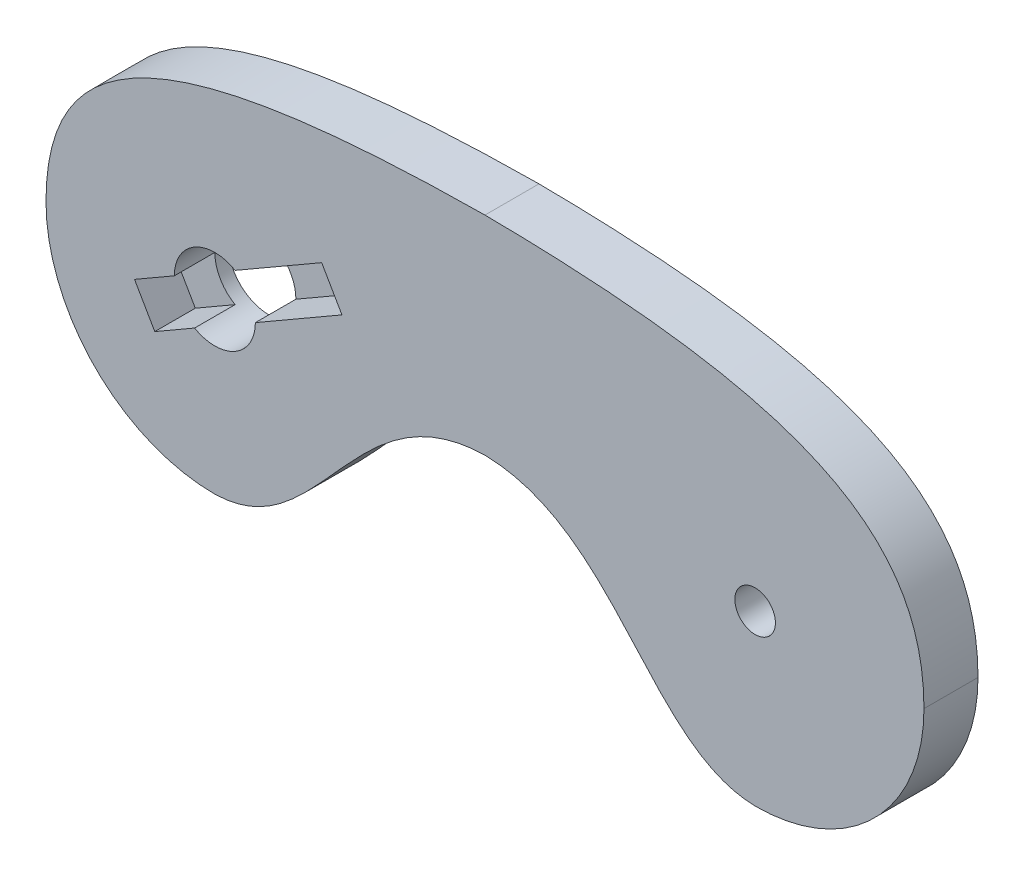
ISO-10303-21;
HEADER;
FILE_DESCRIPTION(('STEP AP214'),'2;1');
FILE_NAME('part.step','',(''),(''),'','','');
FILE_SCHEMA(('AUTOMOTIVE_DESIGN { 1 0 10303 214 1 1 1 1 }'));
ENDSEC;
DATA;
#1=APPLICATION_CONTEXT('core data for automotive mechanical design processes');
#2=APPLICATION_PROTOCOL_DEFINITION('international standard','automotive_design',2000,#1);
#3=PRODUCT_CONTEXT('',#1,'mechanical');
#4=PRODUCT('Part','Part','',(#3));
#5=PRODUCT_RELATED_PRODUCT_CATEGORY('part','',(#4));
#6=PRODUCT_DEFINITION_FORMATION('','',#4);
#7=PRODUCT_DEFINITION_CONTEXT('part definition',#1,'design');
#8=PRODUCT_DEFINITION('design','',#6,#7);
#9=PRODUCT_DEFINITION_SHAPE('','',#8);
#10=(LENGTH_UNIT() NAMED_UNIT(*) SI_UNIT(.MILLI.,.METRE.));
#11=(NAMED_UNIT(*) PLANE_ANGLE_UNIT() SI_UNIT($,.RADIAN.));
#12=(NAMED_UNIT(*) SI_UNIT($,.STERADIAN.) SOLID_ANGLE_UNIT());
#13=UNCERTAINTY_MEASURE_WITH_UNIT(LENGTH_MEASURE(1.E-05),#10,'distance_accuracy_value','');
#14=(GEOMETRIC_REPRESENTATION_CONTEXT(3) GLOBAL_UNCERTAINTY_ASSIGNED_CONTEXT((#13)) GLOBAL_UNIT_ASSIGNED_CONTEXT((#10,
#11,#12)) REPRESENTATION_CONTEXT('',''));
#15=CARTESIAN_POINT('',(0.,0.,0.));
#16=DIRECTION('',(0.,0.,1.));
#17=DIRECTION('',(1.,0.,0.));
#18=AXIS2_PLACEMENT_3D('',#15,#16,#17);
#19=CARTESIAN_POINT('',(104.786762405388,11.7820972603127,4.));
#20=DIRECTION('',(0.,0.,-1.));
#21=DIRECTION('',(-1.,0.,0.));
#22=AXIS2_PLACEMENT_3D('',#19,#20,#21);
#23=PLANE('',#22);
#24=CARTESIAN_POINT('',(112.5,0.,4.));
#25=CARTESIAN_POINT('',(112.5,11.1158308056532,4.));
#26=CARTESIAN_POINT('',(102.764699747701,15.1709178933789,4.));
#27=CARTESIAN_POINT('',(80.,15.3965319854051,4.));
#28=B_SPLINE_CURVE_WITH_KNOTS('',3,(#24,#25,#26,#27),.UNSPECIFIED.,.F.,.F.,(4,4),(0.,1.),.UNSPECIFIED.);
#29=CARTESIAN_POINT('',(112.5,0.,4.));
#30=VERTEX_POINT('',#29);
#31=CARTESIAN_POINT('',(80.,15.3965319854051,4.));
#32=VERTEX_POINT('',#31);
#33=EDGE_CURVE('E191',#30,#32,#28,.T.);
#34=ORIENTED_EDGE('',*,*,#33,.T.);
#35=CARTESIAN_POINT('',(80.,15.3965319854051,4.));
#36=CARTESIAN_POINT('',(57.2353002522993,15.1709178933789,4.));
#37=CARTESIAN_POINT('',(47.5,11.1158308056532,4.));
#38=CARTESIAN_POINT('',(47.5,0.,4.));
#39=B_SPLINE_CURVE_WITH_KNOTS('',3,(#35,#36,#37,#38),.UNSPECIFIED.,.F.,.F.,(4,4),(0.,1.),.UNSPECIFIED.);
#40=CARTESIAN_POINT('',(47.5,0.,4.));
#41=VERTEX_POINT('',#40);
#42=EDGE_CURVE('E197',#32,#41,#39,.T.);
#43=ORIENTED_EDGE('',*,*,#42,.T.);
#44=CARTESIAN_POINT('',(60.,0.,4.));
#45=DIRECTION('',(0.,0.,1.));
#46=DIRECTION('',(-1.,0.,0.));
#47=AXIS2_PLACEMENT_3D('',#44,#45,#46);
#48=CIRCLE('',#47,12.5);
#49=CARTESIAN_POINT('',(60.,-12.5,4.));
#50=VERTEX_POINT('',#49);
#51=EDGE_CURVE('E206',#41,#50,#48,.T.);
#52=ORIENTED_EDGE('',*,*,#51,.T.);
#53=CARTESIAN_POINT('',(60.,-12.5,4.));
#54=CARTESIAN_POINT('',(67.8597913120576,-12.3290143676797,4.));
#55=CARTESIAN_POINT('',(70.1748273884092,-0.222632889192769,4.));
#56=CARTESIAN_POINT('',(80.,0.,4.));
#57=B_SPLINE_CURVE_WITH_KNOTS('',3,(#53,#54,#55,#56),.UNSPECIFIED.,.F.,.F.,(4,4),(0.,1.),.UNSPECIFIED.);
#58=CARTESIAN_POINT('',(80.,0.,4.));
#59=VERTEX_POINT('',#58);
#60=EDGE_CURVE('E226',#50,#59,#57,.T.);
#61=ORIENTED_EDGE('',*,*,#60,.T.);
#62=CARTESIAN_POINT('',(80.,0.,4.));
#63=CARTESIAN_POINT('',(89.8251726115908,-0.222632889192771,4.));
#64=CARTESIAN_POINT('',(92.1402086879425,-12.3290143676797,4.));
#65=CARTESIAN_POINT('',(100.,-12.5,4.));
#66=B_SPLINE_CURVE_WITH_KNOTS('',3,(#62,#63,#64,#65),.UNSPECIFIED.,.F.,.F.,(4,4),(0.,1.),.UNSPECIFIED.);
#67=CARTESIAN_POINT('',(100.,-12.5,4.));
#68=VERTEX_POINT('',#67);
#69=EDGE_CURVE('E230',#59,#68,#66,.T.);
#70=ORIENTED_EDGE('',*,*,#69,.T.);
#71=CARTESIAN_POINT('',(100.,0.,4.));
#72=DIRECTION('',(0.,0.,1.));
#73=DIRECTION('',(-1.,0.,0.));
#74=AXIS2_PLACEMENT_3D('',#71,#72,#73);
#75=CIRCLE('',#74,12.5);
#76=EDGE_CURVE('E238',#68,#30,#75,.T.);
#77=ORIENTED_EDGE('',*,*,#76,.T.);
#78=EDGE_LOOP('',(#34,#43,#52,#61,#70,#77));
#79=FACE_BOUND('',#78,.T.);
#80=CARTESIAN_POINT('',(100.,0.,4.));
#81=DIRECTION('',(0.,0.,1.));
#82=DIRECTION('',(1.,0.,0.));
#83=AXIS2_PLACEMENT_3D('',#80,#81,#82);
#84=CIRCLE('',#83,1.5);
#85=CARTESIAN_POINT('',(101.5,0.,4.));
#86=VERTEX_POINT('',#85);
#87=EDGE_CURVE('E185',#86,#86,#84,.T.);
#88=ORIENTED_EDGE('',*,*,#87,.F.);
#89=EDGE_LOOP('',(#88));
#90=FACE_BOUND('',#89,.T.);
#91=CARTESIAN_POINT('',(60.,0.,4.));
#92=DIRECTION('',(0.,0.,1.));
#93=DIRECTION('',(1.,0.,0.));
#94=AXIS2_PLACEMENT_3D('',#91,#92,#93);
#95=CIRCLE('',#94,3.00000000000001);
#96=CARTESIAN_POINT('',(61.5,2.59807621135331,4.));
#97=VERTEX_POINT('',#96);
#98=CARTESIAN_POINT('',(57.,0.,4.));
#99=VERTEX_POINT('',#98);
#100=EDGE_CURVE('E182',#97,#99,#95,.T.);
#101=ORIENTED_EDGE('',*,*,#100,.F.);
#102=DIRECTION('',(-0.866025403784438,-0.500000000000002,0.));
#103=VECTOR('',#102,1.);
#104=CARTESIAN_POINT('',(54.0538475772934,-1.70096189432335,4.));
#105=LINE('',#104,#103);
#106=CARTESIAN_POINT('',(67.9102540378444,6.29903810567667,4.));
#107=VERTEX_POINT('',#106);
#108=EDGE_CURVE('E159',#107,#97,#105,.T.);
#109=ORIENTED_EDGE('',*,*,#108,.F.);
#110=DIRECTION('',(-0.500000000000004,0.866025403784436,0.));
#111=VECTOR('',#110,1.);
#112=CARTESIAN_POINT('',(69.4102540378444,3.70096189432336,4.));
#113=LINE('',#112,#111);
#114=CARTESIAN_POINT('',(69.4102540378444,3.70096189432336,4.));
#115=VERTEX_POINT('',#114);
#116=EDGE_CURVE('E166',#115,#107,#113,.T.);
#117=ORIENTED_EDGE('',*,*,#116,.F.);
#118=DIRECTION('',(0.866025403784438,0.500000000000001,0.));
#119=VECTOR('',#118,1.);
#120=CARTESIAN_POINT('',(55.5538475772934,-4.29903810567667,4.));
#121=LINE('',#120,#119);
#122=CARTESIAN_POINT('',(63.,0.,4.));
#123=VERTEX_POINT('',#122);
#124=EDGE_CURVE('E167',#123,#115,#121,.T.);
#125=ORIENTED_EDGE('',*,*,#124,.F.);
#126=CARTESIAN_POINT('',(58.5,-2.59807621135334,4.));
#127=VERTEX_POINT('',#126);
#128=EDGE_CURVE('E179',#127,#123,#95,.T.);
#129=ORIENTED_EDGE('',*,*,#128,.F.);
#130=CARTESIAN_POINT('',(55.5538475772934,-4.29903810567667,4.));
#131=VERTEX_POINT('',#130);
#132=EDGE_CURVE('E164',#131,#127,#121,.T.);
#133=ORIENTED_EDGE('',*,*,#132,.F.);
#134=DIRECTION('',(0.499999999999995,-0.866025403784442,0.));
#135=VECTOR('',#134,1.);
#136=CARTESIAN_POINT('',(54.8038475772934,-3.00000000000001,4.));
#137=LINE('',#136,#135);
#138=CARTESIAN_POINT('',(54.0538475772934,-1.70096189432335,4.));
#139=VERTEX_POINT('',#138);
#140=EDGE_CURVE('E143',#139,#131,#137,.T.);
#141=ORIENTED_EDGE('',*,*,#140,.F.);
#142=EDGE_CURVE('E170',#99,#139,#105,.T.);
#143=ORIENTED_EDGE('',*,*,#142,.F.);
#144=EDGE_LOOP('',(#101,#109,#117,#125,#129,#133,#141,#143));
#145=FACE_BOUND('',#144,.T.);
#146=ADVANCED_FACE('F34',(#79,#90,#145),#23,.F.);
#147=CARTESIAN_POINT('',(104.786762405388,11.7820972603127,0.));
#148=DIRECTION('',(0.,0.,-1.));
#149=DIRECTION('',(-1.,0.,0.));
#150=AXIS2_PLACEMENT_3D('',#147,#148,#149);
#151=PLANE('',#150);
#152=CARTESIAN_POINT('',(100.,0.,0.));
#153=DIRECTION('',(0.,0.,1.));
#154=DIRECTION('',(1.,0.,0.));
#155=AXIS2_PLACEMENT_3D('',#152,#153,#154);
#156=CIRCLE('',#155,1.5);
#157=CARTESIAN_POINT('',(101.5,0.,0.));
#158=VERTEX_POINT('',#157);
#159=EDGE_CURVE('E189',#158,#158,#156,.T.);
#160=ORIENTED_EDGE('',*,*,#159,.T.);
#161=EDGE_LOOP('',(#160));
#162=FACE_BOUND('',#161,.T.);
#163=CARTESIAN_POINT('',(112.5,0.,0.));
#164=CARTESIAN_POINT('',(112.5,11.1158308056532,0.));
#165=CARTESIAN_POINT('',(102.764699747701,15.1709178933789,0.));
#166=CARTESIAN_POINT('',(80.,15.3965319854051,0.));
#167=B_SPLINE_CURVE_WITH_KNOTS('',3,(#163,#164,#165,#166),.UNSPECIFIED.,.F.,.F.,(4,4),(0.,1.),.UNSPECIFIED.);
#168=CARTESIAN_POINT('',(112.5,0.,0.));
#169=VERTEX_POINT('',#168);
#170=CARTESIAN_POINT('',(80.,15.3965319854051,0.));
#171=VERTEX_POINT('',#170);
#172=EDGE_CURVE('E188',#169,#171,#167,.T.);
#173=ORIENTED_EDGE('',*,*,#172,.F.);
#174=CARTESIAN_POINT('',(100.,0.,0.));
#175=DIRECTION('',(0.,0.,1.));
#176=DIRECTION('',(-1.,0.,0.));
#177=AXIS2_PLACEMENT_3D('',#174,#175,#176);
#178=CIRCLE('',#177,12.5);
#179=CARTESIAN_POINT('',(100.,-12.5,0.));
#180=VERTEX_POINT('',#179);
#181=EDGE_CURVE('E198',#180,#169,#178,.T.);
#182=ORIENTED_EDGE('',*,*,#181,.F.);
#183=CARTESIAN_POINT('',(80.,0.,0.));
#184=CARTESIAN_POINT('',(89.8251726115908,-0.222632889192771,0.));
#185=CARTESIAN_POINT('',(92.1402086879425,-12.3290143676797,0.));
#186=CARTESIAN_POINT('',(100.,-12.5,0.));
#187=B_SPLINE_CURVE_WITH_KNOTS('',3,(#183,#184,#185,#186),.UNSPECIFIED.,.F.,.F.,(4,4),(0.,1.),.UNSPECIFIED.);
#188=CARTESIAN_POINT('',(80.,0.,0.));
#189=VERTEX_POINT('',#188);
#190=EDGE_CURVE('E264',#189,#180,#187,.T.);
#191=ORIENTED_EDGE('',*,*,#190,.F.);
#192=CARTESIAN_POINT('',(60.,-12.5,0.));
#193=CARTESIAN_POINT('',(67.8597913120576,-12.3290143676797,0.));
#194=CARTESIAN_POINT('',(70.1748273884092,-0.222632889192769,0.));
#195=CARTESIAN_POINT('',(80.,0.,0.));
#196=B_SPLINE_CURVE_WITH_KNOTS('',3,(#192,#193,#194,#195),.UNSPECIFIED.,.F.,.F.,(4,4),(0.,1.),.UNSPECIFIED.);
#197=CARTESIAN_POINT('',(60.,-12.5,0.));
#198=VERTEX_POINT('',#197);
#199=EDGE_CURVE('E260',#198,#189,#196,.T.);
#200=ORIENTED_EDGE('',*,*,#199,.F.);
#201=CARTESIAN_POINT('',(60.,0.,0.));
#202=DIRECTION('',(0.,0.,1.));
#203=DIRECTION('',(-1.,0.,0.));
#204=AXIS2_PLACEMENT_3D('',#201,#202,#203);
#205=CIRCLE('',#204,12.5);
#206=CARTESIAN_POINT('',(47.5,0.,0.));
#207=VERTEX_POINT('',#206);
#208=EDGE_CURVE('E255',#207,#198,#205,.T.);
#209=ORIENTED_EDGE('',*,*,#208,.F.);
#210=CARTESIAN_POINT('',(80.,15.3965319854051,0.));
#211=CARTESIAN_POINT('',(57.2353002522993,15.1709178933789,0.));
#212=CARTESIAN_POINT('',(47.5,11.1158308056532,0.));
#213=CARTESIAN_POINT('',(47.5,0.,0.));
#214=B_SPLINE_CURVE_WITH_KNOTS('',3,(#210,#211,#212,#213),.UNSPECIFIED.,.F.,.F.,(4,4),(0.,1.),.UNSPECIFIED.);
#215=EDGE_CURVE('E248',#171,#207,#214,.T.);
#216=ORIENTED_EDGE('',*,*,#215,.F.);
#217=EDGE_LOOP('',(#173,#182,#191,#200,#209,#216));
#218=FACE_BOUND('',#217,.T.);
#219=CARTESIAN_POINT('',(60.,0.,0.));
#220=DIRECTION('',(0.,0.,1.));
#221=DIRECTION('',(1.,0.,0.));
#222=AXIS2_PLACEMENT_3D('',#219,#220,#221);
#223=CIRCLE('',#222,3.00000000000001);
#224=CARTESIAN_POINT('',(63.,0.,0.));
#225=VERTEX_POINT('',#224);
#226=EDGE_CURVE('E174',#225,#225,#223,.T.);
#227=ORIENTED_EDGE('',*,*,#226,.T.);
#228=EDGE_LOOP('',(#227));
#229=FACE_BOUND('',#228,.T.);
#230=ADVANCED_FACE('F335',(#162,#218,#229),#151,.T.);
#231=DIRECTION('',(0.,0.,-1.));
#232=VECTOR('',#231,1.);
#233=SURFACE_OF_LINEAR_EXTRUSION('',#28,#232);
#234=ORIENTED_EDGE('',*,*,#172,.T.);
#235=DIRECTION('',(0.,0.,-1.));
#236=VECTOR('',#235,1.);
#237=CARTESIAN_POINT('',(80.,15.3965319854051,4.));
#238=LINE('',#237,#236);
#239=EDGE_CURVE('E289',#32,#171,#238,.T.);
#240=ORIENTED_EDGE('',*,*,#239,.F.);
#241=ORIENTED_EDGE('',*,*,#33,.F.);
#242=DIRECTION('',(0.,0.,-1.));
#243=VECTOR('',#242,1.);
#244=CARTESIAN_POINT('',(112.5,0.,4.));
#245=LINE('',#244,#243);
#246=EDGE_CURVE('E243',#30,#169,#245,.T.);
#247=ORIENTED_EDGE('',*,*,#246,.T.);
#248=EDGE_LOOP('',(#234,#240,#241,#247));
#249=FACE_BOUND('',#248,.T.);
#250=ADVANCED_FACE('F36',(#249),#233,.F.);
#251=DIRECTION('',(0.,0.,-1.));
#252=VECTOR('',#251,1.);
#253=SURFACE_OF_LINEAR_EXTRUSION('',#39,#252);
#254=ORIENTED_EDGE('',*,*,#215,.T.);
#255=DIRECTION('',(0.,0.,-1.));
#256=VECTOR('',#255,1.);
#257=CARTESIAN_POINT('',(47.5,0.,4.));
#258=LINE('',#257,#256);
#259=EDGE_CURVE('E286',#41,#207,#258,.T.);
#260=ORIENTED_EDGE('',*,*,#259,.F.);
#261=ORIENTED_EDGE('',*,*,#42,.F.);
#262=ORIENTED_EDGE('',*,*,#239,.T.);
#263=EDGE_LOOP('',(#254,#260,#261,#262));
#264=FACE_BOUND('',#263,.T.);
#265=ADVANCED_FACE('F211',(#264),#253,.F.);
#266=CARTESIAN_POINT('',(60.,0.,4.));
#267=DIRECTION('',(0.,0.,-1.));
#268=DIRECTION('',(-1.,0.,0.));
#269=AXIS2_PLACEMENT_3D('',#266,#267,#268);
#270=CYLINDRICAL_SURFACE('',#269,12.5);
#271=ORIENTED_EDGE('',*,*,#208,.T.);
#272=DIRECTION('',(0.,0.,-1.));
#273=VECTOR('',#272,1.);
#274=CARTESIAN_POINT('',(60.,-12.5,4.));
#275=LINE('',#274,#273);
#276=EDGE_CURVE('E283',#50,#198,#275,.T.);
#277=ORIENTED_EDGE('',*,*,#276,.F.);
#278=ORIENTED_EDGE('',*,*,#51,.F.);
#279=ORIENTED_EDGE('',*,*,#259,.T.);
#280=EDGE_LOOP('',(#271,#277,#278,#279));
#281=FACE_BOUND('',#280,.T.);
#282=ADVANCED_FACE('F214',(#281),#270,.T.);
#283=DIRECTION('',(0.,0.,-1.));
#284=VECTOR('',#283,1.);
#285=SURFACE_OF_LINEAR_EXTRUSION('',#57,#284);
#286=ORIENTED_EDGE('',*,*,#199,.T.);
#287=DIRECTION('',(0.,0.,-1.));
#288=VECTOR('',#287,1.);
#289=CARTESIAN_POINT('',(80.,0.,4.));
#290=LINE('',#289,#288);
#291=EDGE_CURVE('E280',#59,#189,#290,.T.);
#292=ORIENTED_EDGE('',*,*,#291,.F.);
#293=ORIENTED_EDGE('',*,*,#60,.F.);
#294=ORIENTED_EDGE('',*,*,#276,.T.);
#295=EDGE_LOOP('',(#286,#292,#293,#294));
#296=FACE_BOUND('',#295,.T.);
#297=ADVANCED_FACE('F218',(#296),#285,.F.);
#298=DIRECTION('',(0.,0.,-1.));
#299=VECTOR('',#298,1.);
#300=SURFACE_OF_LINEAR_EXTRUSION('',#66,#299);
#301=ORIENTED_EDGE('',*,*,#190,.T.);
#302=DIRECTION('',(0.,0.,-1.));
#303=VECTOR('',#302,1.);
#304=CARTESIAN_POINT('',(100.,-12.5,4.));
#305=LINE('',#304,#303);
#306=EDGE_CURVE('E277',#68,#180,#305,.T.);
#307=ORIENTED_EDGE('',*,*,#306,.F.);
#308=ORIENTED_EDGE('',*,*,#69,.F.);
#309=ORIENTED_EDGE('',*,*,#291,.T.);
#310=EDGE_LOOP('',(#301,#307,#308,#309));
#311=FACE_BOUND('',#310,.T.);
#312=ADVANCED_FACE('F222',(#311),#300,.F.);
#313=CARTESIAN_POINT('',(100.,0.,4.));
#314=DIRECTION('',(0.,0.,-1.));
#315=DIRECTION('',(-1.,0.,0.));
#316=AXIS2_PLACEMENT_3D('',#313,#314,#315);
#317=CYLINDRICAL_SURFACE('',#316,12.5);
#318=ORIENTED_EDGE('',*,*,#181,.T.);
#319=ORIENTED_EDGE('',*,*,#246,.F.);
#320=ORIENTED_EDGE('',*,*,#76,.F.);
#321=ORIENTED_EDGE('',*,*,#306,.T.);
#322=EDGE_LOOP('',(#318,#319,#320,#321));
#323=FACE_BOUND('',#322,.T.);
#324=ADVANCED_FACE('F347',(#323),#317,.T.);
#325=CARTESIAN_POINT('',(100.,0.,4.));
#326=DIRECTION('',(0.,0.,-1.));
#327=DIRECTION('',(-1.,0.,0.));
#328=AXIS2_PLACEMENT_3D('',#325,#326,#327);
#329=CYLINDRICAL_SURFACE('',#328,1.5);
#330=ORIENTED_EDGE('',*,*,#87,.T.);
#331=EDGE_LOOP('',(#330));
#332=FACE_BOUND('',#331,.T.);
#333=ORIENTED_EDGE('',*,*,#159,.F.);
#334=EDGE_LOOP('',(#333));
#335=FACE_BOUND('',#334,.T.);
#336=ADVANCED_FACE('F345',(#332,#335),#329,.F.);
#337=CARTESIAN_POINT('',(60.,0.,4.));
#338=DIRECTION('',(0.,0.,-1.));
#339=DIRECTION('',(-1.,0.,0.));
#340=AXIS2_PLACEMENT_3D('',#337,#338,#339);
#341=CYLINDRICAL_SURFACE('',#340,3.00000000000001);
#342=DIRECTION('',(0.,0.,-1.));
#343=VECTOR('',#342,1.);
#344=CARTESIAN_POINT('',(61.5,2.59807621135331,4.));
#345=LINE('',#344,#343);
#346=CARTESIAN_POINT('',(61.5,2.59807621135331,1.));
#347=VERTEX_POINT('',#346);
#348=EDGE_CURVE('E11',#97,#347,#345,.T.);
#349=ORIENTED_EDGE('',*,*,#348,.F.);
#350=ORIENTED_EDGE('',*,*,#100,.T.);
#351=DIRECTION('',(0.,0.,-1.));
#352=VECTOR('',#351,1.);
#353=CARTESIAN_POINT('',(57.,0.,4.));
#354=LINE('',#353,#352);
#355=CARTESIAN_POINT('',(57.,0.,1.));
#356=VERTEX_POINT('',#355);
#357=EDGE_CURVE('E296',#356,#99,#354,.F.);
#358=ORIENTED_EDGE('',*,*,#357,.F.);
#359=CARTESIAN_POINT('',(60.,0.,1.));
#360=DIRECTION('',(0.,0.,1.));
#361=DIRECTION('',(1.,0.,0.));
#362=AXIS2_PLACEMENT_3D('',#359,#360,#361);
#363=CIRCLE('',#362,3.00000000000001);
#364=CARTESIAN_POINT('',(58.5,-2.59807621135334,1.));
#365=VERTEX_POINT('',#364);
#366=EDGE_CURVE('E292',#356,#365,#363,.T.);
#367=ORIENTED_EDGE('',*,*,#366,.T.);
#368=DIRECTION('',(0.,0.,-1.));
#369=VECTOR('',#368,1.);
#370=CARTESIAN_POINT('',(58.5,-2.59807621135334,4.));
#371=LINE('',#370,#369);
#372=EDGE_CURVE('E150',#127,#365,#371,.T.);
#373=ORIENTED_EDGE('',*,*,#372,.F.);
#374=ORIENTED_EDGE('',*,*,#128,.T.);
#375=DIRECTION('',(0.,0.,-1.));
#376=VECTOR('',#375,1.);
#377=CARTESIAN_POINT('',(63.,0.,4.));
#378=LINE('',#377,#376);
#379=CARTESIAN_POINT('',(63.,0.,1.));
#380=VERTEX_POINT('',#379);
#381=EDGE_CURVE('E43',#380,#123,#378,.F.);
#382=ORIENTED_EDGE('',*,*,#381,.F.);
#383=EDGE_CURVE('E294',#380,#347,#363,.T.);
#384=ORIENTED_EDGE('',*,*,#383,.T.);
#385=EDGE_LOOP('',(#349,#350,#358,#367,#373,#374,#382,#384));
#386=FACE_BOUND('',#385,.T.);
#387=ORIENTED_EDGE('',*,*,#226,.F.);
#388=EDGE_LOOP('',(#387));
#389=FACE_BOUND('',#388,.T.);
#390=ADVANCED_FACE('F304',(#386,#389),#341,.F.);
#391=CARTESIAN_POINT('',(0.,0.,1.));
#392=DIRECTION('',(0.,0.,1.));
#393=DIRECTION('',(1.,0.,0.));
#394=AXIS2_PLACEMENT_3D('',#391,#392,#393);
#395=PLANE('',#394);
#396=DIRECTION('',(-0.866025403784438,-0.500000000000002,0.));
#397=VECTOR('',#396,1.);
#398=CARTESIAN_POINT('',(54.0538475772934,-1.70096189432335,1.));
#399=LINE('',#398,#397);
#400=CARTESIAN_POINT('',(54.0538475772934,-1.70096189432335,1.));
#401=VERTEX_POINT('',#400);
#402=EDGE_CURVE('E157',#356,#401,#399,.T.);
#403=ORIENTED_EDGE('',*,*,#402,.T.);
#404=DIRECTION('',(0.500000000000007,-0.866025403784435,0.));
#405=VECTOR('',#404,1.);
#406=CARTESIAN_POINT('',(54.8038475772934,-3.00000000000001,1.));
#407=LINE('',#406,#405);
#408=CARTESIAN_POINT('',(55.5538475772934,-4.29903810567667,1.));
#409=VERTEX_POINT('',#408);
#410=EDGE_CURVE('E140',#401,#409,#407,.T.);
#411=ORIENTED_EDGE('',*,*,#410,.T.);
#412=DIRECTION('',(0.866025403784438,0.500000000000001,0.));
#413=VECTOR('',#412,1.);
#414=CARTESIAN_POINT('',(55.5538475772934,-4.29903810567667,1.));
#415=LINE('',#414,#413);
#416=EDGE_CURVE('E57',#409,#365,#415,.T.);
#417=ORIENTED_EDGE('',*,*,#416,.T.);
#418=ORIENTED_EDGE('',*,*,#366,.F.);
#419=EDGE_LOOP('',(#403,#411,#417,#418));
#420=FACE_BOUND('',#419,.T.);
#421=ADVANCED_FACE('F155',(#420),#395,.T.);
#422=CARTESIAN_POINT('',(55.5538475772934,-4.29903810567667,1.));
#423=DIRECTION('',(0.500000000000001,-0.866025403784438,0.));
#424=DIRECTION('',(0.866025403784438,0.500000000000001,0.));
#425=AXIS2_PLACEMENT_3D('',#422,#423,#424);
#426=PLANE('',#425);
#427=ORIENTED_EDGE('',*,*,#372,.T.);
#428=ORIENTED_EDGE('',*,*,#416,.F.);
#429=DIRECTION('',(0.,0.,1.));
#430=VECTOR('',#429,1.);
#431=CARTESIAN_POINT('',(55.5538475772934,-4.29903810567667,1.));
#432=LINE('',#431,#430);
#433=EDGE_CURVE('E137',#409,#131,#432,.T.);
#434=ORIENTED_EDGE('',*,*,#433,.T.);
#435=ORIENTED_EDGE('',*,*,#132,.T.);
#436=EDGE_LOOP('',(#427,#428,#434,#435));
#437=FACE_BOUND('',#436,.T.);
#438=ADVANCED_FACE('F148',(#437),#426,.F.);
#439=CARTESIAN_POINT('',(54.0538475772934,-1.70096189432335,1.));
#440=DIRECTION('',(-0.500000000000002,0.866025403784438,0.));
#441=DIRECTION('',(-0.866025403784438,-0.500000000000002,0.));
#442=AXIS2_PLACEMENT_3D('',#439,#440,#441);
#443=PLANE('',#442);
#444=ORIENTED_EDGE('',*,*,#357,.T.);
#445=ORIENTED_EDGE('',*,*,#142,.T.);
#446=DIRECTION('',(0.,0.,1.));
#447=VECTOR('',#446,1.);
#448=CARTESIAN_POINT('',(54.0538475772934,-1.70096189432335,1.));
#449=LINE('',#448,#447);
#450=EDGE_CURVE('E172',#401,#139,#449,.T.);
#451=ORIENTED_EDGE('',*,*,#450,.F.);
#452=ORIENTED_EDGE('',*,*,#402,.F.);
#453=EDGE_LOOP('',(#444,#445,#451,#452));
#454=FACE_BOUND('',#453,.T.);
#455=ADVANCED_FACE('F322',(#454),#443,.F.);
#456=CARTESIAN_POINT('',(54.8038475772934,-3.00000000000001,1.));
#457=DIRECTION('',(-0.866025403784442,-0.499999999999995,0.));
#458=DIRECTION('',(0.499999999999995,-0.866025403784442,0.));
#459=AXIS2_PLACEMENT_3D('',#456,#457,#458);
#460=PLANE('',#459);
#461=ORIENTED_EDGE('',*,*,#140,.T.);
#462=ORIENTED_EDGE('',*,*,#433,.F.);
#463=ORIENTED_EDGE('',*,*,#410,.F.);
#464=ORIENTED_EDGE('',*,*,#450,.T.);
#465=EDGE_LOOP('',(#461,#462,#463,#464));
#466=FACE_BOUND('',#465,.T.);
#467=ADVANCED_FACE('F138',(#466),#460,.F.);
#468=ORIENTED_EDGE('',*,*,#348,.T.);
#469=CARTESIAN_POINT('',(67.9102540378444,6.29903810567667,1.));
#470=VERTEX_POINT('',#469);
#471=EDGE_CURVE('E50',#470,#347,#399,.T.);
#472=ORIENTED_EDGE('',*,*,#471,.F.);
#473=DIRECTION('',(0.,0.,1.));
#474=VECTOR('',#473,1.);
#475=CARTESIAN_POINT('',(67.9102540378444,6.29903810567667,1.));
#476=LINE('',#475,#474);
#477=EDGE_CURVE('E175',#470,#107,#476,.T.);
#478=ORIENTED_EDGE('',*,*,#477,.T.);
#479=ORIENTED_EDGE('',*,*,#108,.T.);
#480=EDGE_LOOP('',(#468,#472,#478,#479));
#481=FACE_BOUND('',#480,.T.);
#482=ADVANCED_FACE('F317',(#481),#443,.F.);
#483=CARTESIAN_POINT('',(69.4102540378444,3.70096189432336,1.));
#484=VERTEX_POINT('',#483);
#485=EDGE_CURVE('E153',#380,#484,#415,.T.);
#486=ORIENTED_EDGE('',*,*,#485,.T.);
#487=DIRECTION('',(-0.500000000000004,0.866025403784436,0.));
#488=VECTOR('',#487,1.);
#489=CARTESIAN_POINT('',(69.4102540378444,3.70096189432336,1.));
#490=LINE('',#489,#488);
#491=EDGE_CURVE('E152',#484,#470,#490,.T.);
#492=ORIENTED_EDGE('',*,*,#491,.T.);
#493=ORIENTED_EDGE('',*,*,#471,.T.);
#494=ORIENTED_EDGE('',*,*,#383,.F.);
#495=EDGE_LOOP('',(#486,#492,#493,#494));
#496=FACE_BOUND('',#495,.T.);
#497=ADVANCED_FACE('F308',(#496),#395,.T.);
#498=CARTESIAN_POINT('',(69.4102540378444,3.70096189432336,1.));
#499=DIRECTION('',(0.866025403784436,0.500000000000004,0.));
#500=DIRECTION('',(-0.500000000000004,0.866025403784437,0.));
#501=AXIS2_PLACEMENT_3D('',#498,#499,#500);
#502=PLANE('',#501);
#503=ORIENTED_EDGE('',*,*,#116,.T.);
#504=ORIENTED_EDGE('',*,*,#477,.F.);
#505=ORIENTED_EDGE('',*,*,#491,.F.);
#506=DIRECTION('',(0.,0.,1.));
#507=VECTOR('',#506,1.);
#508=CARTESIAN_POINT('',(69.4102540378444,3.70096189432336,1.));
#509=LINE('',#508,#507);
#510=EDGE_CURVE('E146',#484,#115,#509,.T.);
#511=ORIENTED_EDGE('',*,*,#510,.T.);
#512=EDGE_LOOP('',(#503,#504,#505,#511));
#513=FACE_BOUND('',#512,.T.);
#514=ADVANCED_FACE('F314',(#513),#502,.F.);
#515=ORIENTED_EDGE('',*,*,#381,.T.);
#516=ORIENTED_EDGE('',*,*,#124,.T.);
#517=ORIENTED_EDGE('',*,*,#510,.F.);
#518=ORIENTED_EDGE('',*,*,#485,.F.);
#519=EDGE_LOOP('',(#515,#516,#517,#518));
#520=FACE_BOUND('',#519,.T.);
#521=ADVANCED_FACE('F310',(#520),#426,.F.);
#522=CLOSED_SHELL('',(#146,#230,#250,#265,#282,#297,#312,#324,#336,#390,#421,#438,#455,#467,
#482,#497,#514,#521));
#523=MANIFOLD_SOLID_BREP('B2',#522);
#524=ADVANCED_BREP_SHAPE_REPRESENTATION('',(#18,#523),#14);
#525=SHAPE_DEFINITION_REPRESENTATION(#9,#524);
ENDSEC;
END-ISO-10303-21;
